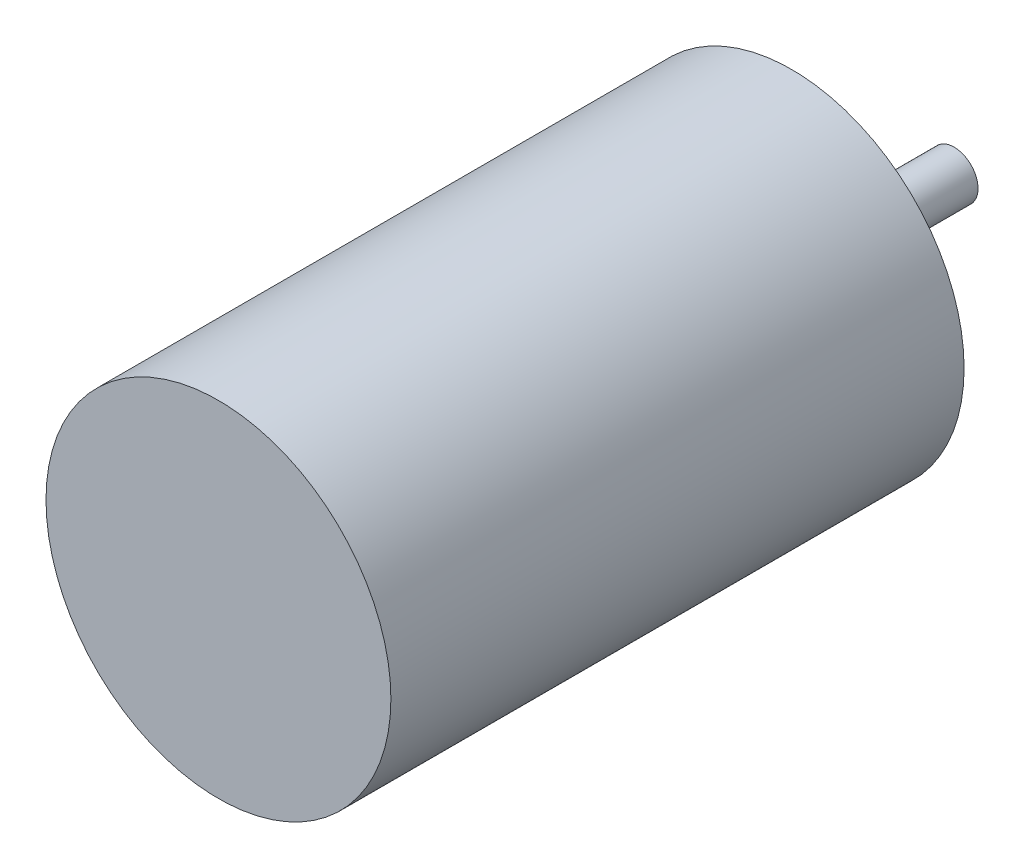
ISO-10303-21;
HEADER;
FILE_DESCRIPTION(('STEP AP214'),'2;1');
FILE_NAME('part.step','',(''),(''),'','','');
FILE_SCHEMA(('AUTOMOTIVE_DESIGN { 1 0 10303 214 1 1 1 1 }'));
ENDSEC;
DATA;
#1=APPLICATION_CONTEXT('core data for automotive mechanical design processes');
#2=APPLICATION_PROTOCOL_DEFINITION('international standard','automotive_design',2000,#1);
#3=PRODUCT_CONTEXT('',#1,'mechanical');
#4=PRODUCT('Part','Part','',(#3));
#5=PRODUCT_RELATED_PRODUCT_CATEGORY('part','',(#4));
#6=PRODUCT_DEFINITION_FORMATION('','',#4);
#7=PRODUCT_DEFINITION_CONTEXT('part definition',#1,'design');
#8=PRODUCT_DEFINITION('design','',#6,#7);
#9=PRODUCT_DEFINITION_SHAPE('','',#8);
#10=(LENGTH_UNIT() NAMED_UNIT(*) SI_UNIT(.MILLI.,.METRE.));
#11=(NAMED_UNIT(*) PLANE_ANGLE_UNIT() SI_UNIT($,.RADIAN.));
#12=(NAMED_UNIT(*) SI_UNIT($,.STERADIAN.) SOLID_ANGLE_UNIT());
#13=UNCERTAINTY_MEASURE_WITH_UNIT(LENGTH_MEASURE(1.E-05),#10,'distance_accuracy_value','');
#14=(GEOMETRIC_REPRESENTATION_CONTEXT(3) GLOBAL_UNCERTAINTY_ASSIGNED_CONTEXT((#13)) GLOBAL_UNIT_ASSIGNED_CONTEXT((#10,
#11,#12)) REPRESENTATION_CONTEXT('',''));
#15=CARTESIAN_POINT('',(0.,0.,0.));
#16=DIRECTION('',(0.,0.,1.));
#17=DIRECTION('',(1.,0.,0.));
#18=AXIS2_PLACEMENT_3D('',#15,#16,#17);
#19=CARTESIAN_POINT('',(0.,0.,0.));
#20=DIRECTION('',(0.,0.,1.));
#21=DIRECTION('',(1.,0.,0.));
#22=AXIS2_PLACEMENT_3D('',#19,#20,#21);
#23=PLANE('',#22);
#24=CARTESIAN_POINT('',(0.,0.,0.));
#25=DIRECTION('',(0.,0.,1.));
#26=DIRECTION('',(1.,0.,0.));
#27=AXIS2_PLACEMENT_3D('',#24,#25,#26);
#28=CIRCLE('',#27,2.499995);
#29=CARTESIAN_POINT('',(-2.499995,0.,0.));
#30=VERTEX_POINT('',#29);
#31=EDGE_CURVE('E56',#30,#30,#28,.T.);
#32=ORIENTED_EDGE('',*,*,#31,.T.);
#33=EDGE_LOOP('',(#32));
#34=FACE_BOUND('',#33,.T.);
#35=CARTESIAN_POINT('',(0.,0.,0.));
#36=DIRECTION('',(0.,0.,1.));
#37=DIRECTION('',(1.,0.,0.));
#38=AXIS2_PLACEMENT_3D('',#35,#36,#37);
#39=CIRCLE('',#38,18.034);
#40=CARTESIAN_POINT('',(-18.034,0.,0.));
#41=VERTEX_POINT('',#40);
#42=EDGE_CURVE('E10',#41,#41,#39,.T.);
#43=ORIENTED_EDGE('',*,*,#42,.F.);
#44=EDGE_LOOP('',(#43));
#45=FACE_BOUND('',#44,.T.);
#46=ADVANCED_FACE('F16',(#34,#45),#23,.F.);
#47=CARTESIAN_POINT('',(0.,0.,59.944));
#48=DIRECTION('',(0.,0.,1.));
#49=DIRECTION('',(1.,0.,0.));
#50=AXIS2_PLACEMENT_3D('',#47,#48,#49);
#51=PLANE('',#50);
#52=CARTESIAN_POINT('',(0.,0.,59.944));
#53=DIRECTION('',(0.,0.,1.));
#54=DIRECTION('',(1.,0.,0.));
#55=AXIS2_PLACEMENT_3D('',#52,#53,#54);
#56=CIRCLE('',#55,18.034);
#57=CARTESIAN_POINT('',(-18.034,0.,59.944));
#58=VERTEX_POINT('',#57);
#59=EDGE_CURVE('E69',#58,#58,#56,.T.);
#60=ORIENTED_EDGE('',*,*,#59,.T.);
#61=EDGE_LOOP('',(#60));
#62=FACE_BOUND('',#61,.T.);
#63=ADVANCED_FACE('F76',(#62),#51,.T.);
#64=CARTESIAN_POINT('',(0.,0.,0.));
#65=DIRECTION('',(0.,0.,1.));
#66=DIRECTION('',(1.,0.,0.));
#67=AXIS2_PLACEMENT_3D('',#64,#65,#66);
#68=CYLINDRICAL_SURFACE('',#67,18.034);
#69=ORIENTED_EDGE('',*,*,#59,.F.);
#70=DIRECTION('',(0.,0.,-1.));
#71=VECTOR('',#70,1.);
#72=CARTESIAN_POINT('',(-18.034,0.,0.));
#73=LINE('',#72,#71);
#74=EDGE_CURVE('E24',#58,#41,#73,.T.);
#75=ORIENTED_EDGE('',*,*,#74,.T.);
#76=ORIENTED_EDGE('',*,*,#42,.T.);
#77=ORIENTED_EDGE('',*,*,#74,.F.);
#78=EDGE_LOOP('',(#69,#75,#76,#77));
#79=FACE_BOUND('',#78,.T.);
#80=ADVANCED_FACE('F74',(#79),#68,.T.);
#81=CARTESIAN_POINT('',(0.,0.,-16.9926));
#82=DIRECTION('',(0.,0.,1.));
#83=DIRECTION('',(1.,0.,0.));
#84=AXIS2_PLACEMENT_3D('',#81,#82,#83);
#85=PLANE('',#84);
#86=CARTESIAN_POINT('',(0.,0.,-16.9926));
#87=DIRECTION('',(0.,0.,-1.));
#88=DIRECTION('',(1.,0.,0.));
#89=AXIS2_PLACEMENT_3D('',#86,#87,#88);
#90=CIRCLE('',#89,2.499995);
#91=CARTESIAN_POINT('',(-2.499995,0.,-16.9926));
#92=VERTEX_POINT('',#91);
#93=EDGE_CURVE('E55',#92,#92,#90,.T.);
#94=ORIENTED_EDGE('',*,*,#93,.T.);
#95=EDGE_LOOP('',(#94));
#96=FACE_BOUND('',#95,.T.);
#97=ADVANCED_FACE('F60',(#96),#85,.F.);
#98=CARTESIAN_POINT('',(0.,0.,0.));
#99=DIRECTION('',(0.,0.,-1.));
#100=DIRECTION('',(1.,0.,0.));
#101=AXIS2_PLACEMENT_3D('',#98,#99,#100);
#102=CYLINDRICAL_SURFACE('',#101,2.499995);
#103=ORIENTED_EDGE('',*,*,#93,.F.);
#104=DIRECTION('',(0.,0.,1.));
#105=VECTOR('',#104,1.);
#106=CARTESIAN_POINT('',(-2.499995,0.,0.));
#107=LINE('',#106,#105);
#108=EDGE_CURVE('E52',#92,#30,#107,.T.);
#109=ORIENTED_EDGE('',*,*,#108,.T.);
#110=ORIENTED_EDGE('',*,*,#31,.F.);
#111=ORIENTED_EDGE('',*,*,#108,.F.);
#112=EDGE_LOOP('',(#103,#109,#110,#111));
#113=FACE_BOUND('',#112,.T.);
#114=ADVANCED_FACE('F54',(#113),#102,.T.);
#115=CLOSED_SHELL('',(#46,#63,#80,#97,#114));
#116=MANIFOLD_SOLID_BREP('B1',#115);
#117=ADVANCED_BREP_SHAPE_REPRESENTATION('',(#18,#116),#14);
#118=SHAPE_DEFINITION_REPRESENTATION(#9,#117);
ENDSEC;
END-ISO-10303-21;
